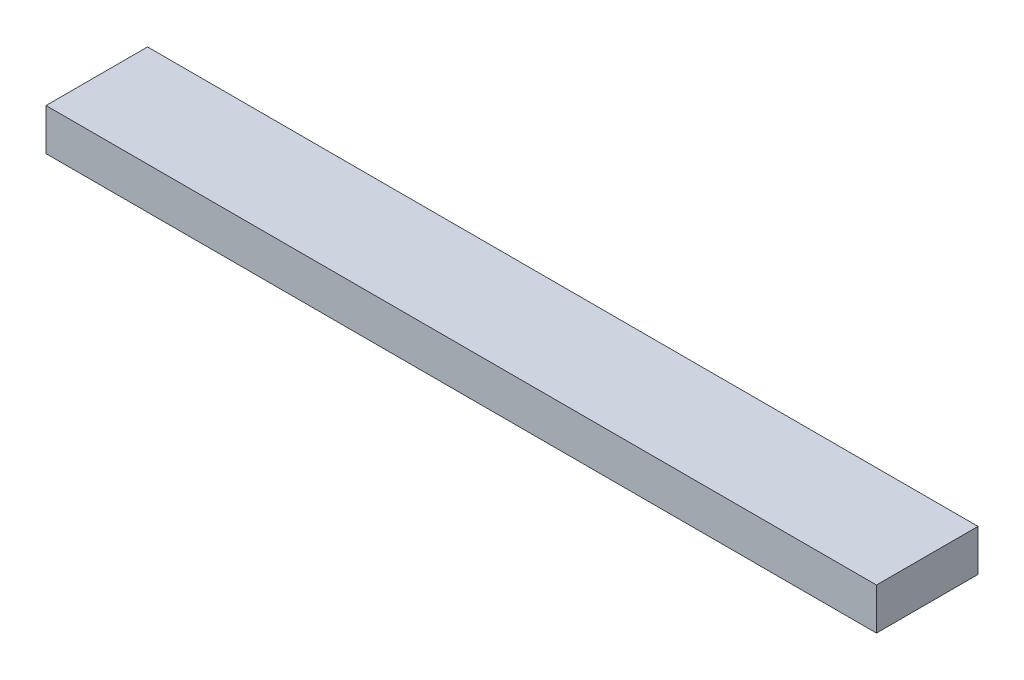
ISO-10303-21;
HEADER;
FILE_DESCRIPTION(('STEP AP214'),'2;1');
FILE_NAME('part.step','',(''),(''),'','','');
FILE_SCHEMA(('AUTOMOTIVE_DESIGN { 1 0 10303 214 1 1 1 1 }'));
ENDSEC;
DATA;
#1=APPLICATION_CONTEXT('core data for automotive mechanical design processes');
#2=APPLICATION_PROTOCOL_DEFINITION('international standard','automotive_design',2000,#1);
#3=PRODUCT_CONTEXT('',#1,'mechanical');
#4=PRODUCT('Part','Part','',(#3));
#5=PRODUCT_RELATED_PRODUCT_CATEGORY('part','',(#4));
#6=PRODUCT_DEFINITION_FORMATION('','',#4);
#7=PRODUCT_DEFINITION_CONTEXT('part definition',#1,'design');
#8=PRODUCT_DEFINITION('design','',#6,#7);
#9=PRODUCT_DEFINITION_SHAPE('','',#8);
#10=(LENGTH_UNIT() NAMED_UNIT(*) SI_UNIT(.MILLI.,.METRE.));
#11=(NAMED_UNIT(*) PLANE_ANGLE_UNIT() SI_UNIT($,.RADIAN.));
#12=(NAMED_UNIT(*) SI_UNIT($,.STERADIAN.) SOLID_ANGLE_UNIT());
#13=UNCERTAINTY_MEASURE_WITH_UNIT(LENGTH_MEASURE(1.E-05),#10,'distance_accuracy_value','');
#14=(GEOMETRIC_REPRESENTATION_CONTEXT(3) GLOBAL_UNCERTAINTY_ASSIGNED_CONTEXT((#13)) GLOBAL_UNIT_ASSIGNED_CONTEXT((#10,
#11,#12)) REPRESENTATION_CONTEXT('',''));
#15=CARTESIAN_POINT('',(0.,0.,0.));
#16=DIRECTION('',(0.,0.,1.));
#17=DIRECTION('',(1.,0.,0.));
#18=AXIS2_PLACEMENT_3D('',#15,#16,#17);
#19=CARTESIAN_POINT('',(0.,0.,0.));
#20=DIRECTION('',(0.,1.,0.));
#21=DIRECTION('',(0.,0.,1.));
#22=AXIS2_PLACEMENT_3D('',#19,#20,#21);
#23=PLANE('',#22);
#24=CARTESIAN_POINT('',(-28.,0.,0.));
#25=DIRECTION('',(0.,1.,0.));
#26=DIRECTION('',(0.,0.,1.));
#27=AXIS2_PLACEMENT_3D('',#24,#25,#26);
#28=CIRCLE('',#27,2.5);
#29=CARTESIAN_POINT('',(-28.,0.,2.5));
#30=VERTEX_POINT('',#29);
#31=EDGE_CURVE('E333',#30,#30,#28,.T.);
#32=ORIENTED_EDGE('',*,*,#31,.T.);
#33=EDGE_LOOP('',(#32));
#34=FACE_BOUND('',#33,.T.);
#35=CARTESIAN_POINT('',(28.,0.,0.));
#36=DIRECTION('',(0.,1.,0.));
#37=DIRECTION('',(0.,0.,1.));
#38=AXIS2_PLACEMENT_3D('',#35,#36,#37);
#39=CIRCLE('',#38,2.5);
#40=CARTESIAN_POINT('',(28.,0.,2.5));
#41=VERTEX_POINT('',#40);
#42=EDGE_CURVE('E344',#41,#41,#39,.T.);
#43=ORIENTED_EDGE('',*,*,#42,.T.);
#44=EDGE_LOOP('',(#43));
#45=FACE_BOUND('',#44,.T.);
#46=CARTESIAN_POINT('',(12.,0.,0.));
#47=DIRECTION('',(0.,1.,0.));
#48=DIRECTION('',(0.,0.,1.));
#49=AXIS2_PLACEMENT_3D('',#46,#47,#48);
#50=CIRCLE('',#49,2.5);
#51=CARTESIAN_POINT('',(12.,0.,2.5));
#52=VERTEX_POINT('',#51);
#53=EDGE_CURVE('E356',#52,#52,#50,.T.);
#54=ORIENTED_EDGE('',*,*,#53,.T.);
#55=EDGE_LOOP('',(#54));
#56=FACE_BOUND('',#55,.T.);
#57=CARTESIAN_POINT('',(-12.,0.,0.));
#58=DIRECTION('',(0.,1.,0.));
#59=DIRECTION('',(0.,0.,1.));
#60=AXIS2_PLACEMENT_3D('',#57,#58,#59);
#61=CIRCLE('',#60,2.5);
#62=CARTESIAN_POINT('',(-12.,0.,2.5));
#63=VERTEX_POINT('',#62);
#64=EDGE_CURVE('E365',#63,#63,#61,.T.);
#65=ORIENTED_EDGE('',*,*,#64,.T.);
#66=EDGE_LOOP('',(#65));
#67=FACE_BOUND('',#66,.T.);
#68=DIRECTION('',(0.,0.,-1.));
#69=VECTOR('',#68,1.);
#70=CARTESIAN_POINT('',(-31.9,0.,0.));
#71=LINE('',#70,#69);
#72=CARTESIAN_POINT('',(-31.9,0.,3.9));
#73=VERTEX_POINT('',#72);
#74=CARTESIAN_POINT('',(-31.9,0.,-3.9));
#75=VERTEX_POINT('',#74);
#76=EDGE_CURVE('E102',#73,#75,#71,.T.);
#77=ORIENTED_EDGE('',*,*,#76,.T.);
#78=DIRECTION('',(-1.,0.,0.));
#79=VECTOR('',#78,1.);
#80=CARTESIAN_POINT('',(0.,0.,-3.9));
#81=LINE('',#80,#79);
#82=CARTESIAN_POINT('',(31.9,0.,-3.9));
#83=VERTEX_POINT('',#82);
#84=EDGE_CURVE('E97',#83,#75,#81,.T.);
#85=ORIENTED_EDGE('',*,*,#84,.F.);
#86=DIRECTION('',(0.,0.,-1.));
#87=VECTOR('',#86,1.);
#88=CARTESIAN_POINT('',(31.9,0.,0.));
#89=LINE('',#88,#87);
#90=CARTESIAN_POINT('',(31.9,0.,3.9));
#91=VERTEX_POINT('',#90);
#92=EDGE_CURVE('E69',#91,#83,#89,.T.);
#93=ORIENTED_EDGE('',*,*,#92,.F.);
#94=DIRECTION('',(-1.,0.,0.));
#95=VECTOR('',#94,1.);
#96=CARTESIAN_POINT('',(0.,0.,3.9));
#97=LINE('',#96,#95);
#98=EDGE_CURVE('E89',#91,#73,#97,.T.);
#99=ORIENTED_EDGE('',*,*,#98,.T.);
#100=EDGE_LOOP('',(#77,#85,#93,#99));
#101=FACE_BOUND('',#100,.T.);
#102=CARTESIAN_POINT('',(-3.99999999999999,0.,0.));
#103=DIRECTION('',(0.,1.,0.));
#104=DIRECTION('',(0.,0.,1.));
#105=AXIS2_PLACEMENT_3D('',#102,#103,#104);
#106=CIRCLE('',#105,2.5);
#107=CARTESIAN_POINT('',(-3.99999999999999,0.,2.5));
#108=VERTEX_POINT('',#107);
#109=EDGE_CURVE('E362',#108,#108,#106,.T.);
#110=ORIENTED_EDGE('',*,*,#109,.T.);
#111=EDGE_LOOP('',(#110));
#112=FACE_BOUND('',#111,.T.);
#113=CARTESIAN_POINT('',(20.,0.,0.));
#114=DIRECTION('',(0.,1.,0.));
#115=DIRECTION('',(0.,0.,1.));
#116=AXIS2_PLACEMENT_3D('',#113,#114,#115);
#117=CIRCLE('',#116,2.5);
#118=CARTESIAN_POINT('',(20.,0.,2.5));
#119=VERTEX_POINT('',#118);
#120=EDGE_CURVE('E350',#119,#119,#117,.T.);
#121=ORIENTED_EDGE('',*,*,#120,.T.);
#122=EDGE_LOOP('',(#121));
#123=FACE_BOUND('',#122,.T.);
#124=CARTESIAN_POINT('',(-20.,0.,0.));
#125=DIRECTION('',(0.,1.,0.));
#126=DIRECTION('',(0.,0.,1.));
#127=AXIS2_PLACEMENT_3D('',#124,#125,#126);
#128=CIRCLE('',#127,2.5);
#129=CARTESIAN_POINT('',(-20.,0.,2.5));
#130=VERTEX_POINT('',#129);
#131=EDGE_CURVE('E338',#130,#130,#128,.T.);
#132=ORIENTED_EDGE('',*,*,#131,.T.);
#133=EDGE_LOOP('',(#132));
#134=FACE_BOUND('',#133,.T.);
#135=CARTESIAN_POINT('',(4.00000000000001,0.,0.));
#136=DIRECTION('',(0.,1.,0.));
#137=DIRECTION('',(0.,0.,1.));
#138=AXIS2_PLACEMENT_3D('',#135,#136,#137);
#139=CIRCLE('',#138,2.5);
#140=CARTESIAN_POINT('',(4.00000000000001,0.,2.5));
#141=VERTEX_POINT('',#140);
#142=EDGE_CURVE('E327',#141,#141,#139,.T.);
#143=ORIENTED_EDGE('',*,*,#142,.T.);
#144=EDGE_LOOP('',(#143));
#145=FACE_BOUND('',#144,.T.);
#146=ADVANCED_FACE('F37',(#34,#45,#56,#67,#101,#112,#123,#134,#145),#23,.F.);
#147=CARTESIAN_POINT('',(-31.9,3.2,0.));
#148=DIRECTION('',(-1.,0.,0.));
#149=DIRECTION('',(0.,0.,1.));
#150=AXIS2_PLACEMENT_3D('',#147,#148,#149);
#151=PLANE('',#150);
#152=ORIENTED_EDGE('',*,*,#76,.F.);
#153=DIRECTION('',(0.,-1.,0.));
#154=VECTOR('',#153,1.);
#155=CARTESIAN_POINT('',(-31.9,3.2,3.9));
#156=LINE('',#155,#154);
#157=CARTESIAN_POINT('',(-31.9,3.2,3.9));
#158=VERTEX_POINT('',#157);
#159=EDGE_CURVE('E11',#158,#73,#156,.T.);
#160=ORIENTED_EDGE('',*,*,#159,.F.);
#161=DIRECTION('',(0.,0.,-1.));
#162=VECTOR('',#161,1.);
#163=CARTESIAN_POINT('',(-31.9,3.2,0.));
#164=LINE('',#163,#162);
#165=CARTESIAN_POINT('',(-31.9,3.2,-3.9));
#166=VERTEX_POINT('',#165);
#167=EDGE_CURVE('E95',#158,#166,#164,.T.);
#168=ORIENTED_EDGE('',*,*,#167,.T.);
#169=DIRECTION('',(0.,-1.,0.));
#170=VECTOR('',#169,1.);
#171=CARTESIAN_POINT('',(-31.9,3.2,-3.9));
#172=LINE('',#171,#170);
#173=EDGE_CURVE('E76',#166,#75,#172,.T.);
#174=ORIENTED_EDGE('',*,*,#173,.T.);
#175=EDGE_LOOP('',(#152,#160,#168,#174));
#176=FACE_BOUND('',#175,.T.);
#177=ADVANCED_FACE('F39',(#176),#151,.T.);
#178=CARTESIAN_POINT('',(0.,3.2,3.9));
#179=DIRECTION('',(0.,0.,1.));
#180=DIRECTION('',(1.,0.,0.));
#181=AXIS2_PLACEMENT_3D('',#178,#179,#180);
#182=PLANE('',#181);
#183=ORIENTED_EDGE('',*,*,#98,.F.);
#184=DIRECTION('',(0.,-1.,0.));
#185=VECTOR('',#184,1.);
#186=CARTESIAN_POINT('',(31.9,3.2,3.9));
#187=LINE('',#186,#185);
#188=CARTESIAN_POINT('',(31.9,3.2,3.9));
#189=VERTEX_POINT('',#188);
#190=EDGE_CURVE('E46',#189,#91,#187,.T.);
#191=ORIENTED_EDGE('',*,*,#190,.F.);
#192=DIRECTION('',(-1.,0.,0.));
#193=VECTOR('',#192,1.);
#194=CARTESIAN_POINT('',(0.,3.2,3.9));
#195=LINE('',#194,#193);
#196=EDGE_CURVE('E87',#189,#158,#195,.T.);
#197=ORIENTED_EDGE('',*,*,#196,.T.);
#198=ORIENTED_EDGE('',*,*,#159,.T.);
#199=EDGE_LOOP('',(#183,#191,#197,#198));
#200=FACE_BOUND('',#199,.T.);
#201=ADVANCED_FACE('F85',(#200),#182,.T.);
#202=CARTESIAN_POINT('',(31.9,3.2,0.));
#203=DIRECTION('',(-1.,0.,0.));
#204=DIRECTION('',(0.,0.,1.));
#205=AXIS2_PLACEMENT_3D('',#202,#203,#204);
#206=PLANE('',#205);
#207=ORIENTED_EDGE('',*,*,#92,.T.);
#208=DIRECTION('',(0.,-1.,0.));
#209=VECTOR('',#208,1.);
#210=CARTESIAN_POINT('',(31.9,3.2,-3.9));
#211=LINE('',#210,#209);
#212=CARTESIAN_POINT('',(31.9,3.2,-3.9));
#213=VERTEX_POINT('',#212);
#214=EDGE_CURVE('E90',#213,#83,#211,.T.);
#215=ORIENTED_EDGE('',*,*,#214,.F.);
#216=DIRECTION('',(0.,0.,-1.));
#217=VECTOR('',#216,1.);
#218=CARTESIAN_POINT('',(31.9,3.2,0.));
#219=LINE('',#218,#217);
#220=EDGE_CURVE('E91',#189,#213,#219,.T.);
#221=ORIENTED_EDGE('',*,*,#220,.F.);
#222=ORIENTED_EDGE('',*,*,#190,.T.);
#223=EDGE_LOOP('',(#207,#215,#221,#222));
#224=FACE_BOUND('',#223,.T.);
#225=ADVANCED_FACE('F92',(#224),#206,.F.);
#226=CARTESIAN_POINT('',(0.,3.2,-3.9));
#227=DIRECTION('',(0.,0.,1.));
#228=DIRECTION('',(1.,0.,0.));
#229=AXIS2_PLACEMENT_3D('',#226,#227,#228);
#230=PLANE('',#229);
#231=ORIENTED_EDGE('',*,*,#84,.T.);
#232=ORIENTED_EDGE('',*,*,#173,.F.);
#233=DIRECTION('',(-1.,0.,0.));
#234=VECTOR('',#233,1.);
#235=CARTESIAN_POINT('',(0.,3.2,-3.9));
#236=LINE('',#235,#234);
#237=EDGE_CURVE('E54',#213,#166,#236,.T.);
#238=ORIENTED_EDGE('',*,*,#237,.F.);
#239=ORIENTED_EDGE('',*,*,#214,.T.);
#240=EDGE_LOOP('',(#231,#232,#238,#239));
#241=FACE_BOUND('',#240,.T.);
#242=ADVANCED_FACE('F112',(#241),#230,.F.);
#243=CARTESIAN_POINT('',(0.,3.2,0.));
#244=DIRECTION('',(0.,1.,0.));
#245=DIRECTION('',(0.,0.,1.));
#246=AXIS2_PLACEMENT_3D('',#243,#244,#245);
#247=PLANE('',#246);
#248=ORIENTED_EDGE('',*,*,#167,.F.);
#249=ORIENTED_EDGE('',*,*,#196,.F.);
#250=ORIENTED_EDGE('',*,*,#220,.T.);
#251=ORIENTED_EDGE('',*,*,#237,.T.);
#252=EDGE_LOOP('',(#248,#249,#250,#251));
#253=FACE_BOUND('',#252,.T.);
#254=ADVANCED_FACE('F94',(#253),#247,.T.);
#255=CARTESIAN_POINT('',(-12.,1.8,0.));
#256=DIRECTION('',(0.,-1.,0.));
#257=DIRECTION('',(0.,0.,-1.));
#258=AXIS2_PLACEMENT_3D('',#255,#256,#257);
#259=CYLINDRICAL_SURFACE('',#258,2.5);
#260=CARTESIAN_POINT('',(-12.,1.8,0.));
#261=DIRECTION('',(0.,1.,0.));
#262=DIRECTION('',(0.,0.,1.));
#263=AXIS2_PLACEMENT_3D('',#260,#261,#262);
#264=CIRCLE('',#263,2.5);
#265=CARTESIAN_POINT('',(-12.,1.8,2.5));
#266=VERTEX_POINT('',#265);
#267=EDGE_CURVE('E105',#266,#266,#264,.T.);
#268=ORIENTED_EDGE('',*,*,#267,.T.);
#269=EDGE_LOOP('',(#268));
#270=FACE_BOUND('',#269,.T.);
#271=ORIENTED_EDGE('',*,*,#64,.F.);
#272=EDGE_LOOP('',(#271));
#273=FACE_BOUND('',#272,.T.);
#274=ADVANCED_FACE('F146',(#270,#273),#259,.F.);
#275=CARTESIAN_POINT('',(0.,1.8,0.));
#276=DIRECTION('',(0.,1.,0.));
#277=DIRECTION('',(0.,0.,1.));
#278=AXIS2_PLACEMENT_3D('',#275,#276,#277);
#279=PLANE('',#278);
#280=ORIENTED_EDGE('',*,*,#267,.F.);
#281=EDGE_LOOP('',(#280));
#282=FACE_BOUND('',#281,.T.);
#283=ADVANCED_FACE('F152',(#282),#279,.F.);
#284=CARTESIAN_POINT('',(-3.99999999999999,1.8,0.));
#285=DIRECTION('',(0.,-1.,0.));
#286=DIRECTION('',(0.,0.,-1.));
#287=AXIS2_PLACEMENT_3D('',#284,#285,#286);
#288=CYLINDRICAL_SURFACE('',#287,2.5);
#289=CARTESIAN_POINT('',(-3.99999999999999,1.8,0.));
#290=DIRECTION('',(0.,1.,0.));
#291=DIRECTION('',(0.,0.,1.));
#292=AXIS2_PLACEMENT_3D('',#289,#290,#291);
#293=CIRCLE('',#292,2.5);
#294=CARTESIAN_POINT('',(-3.99999999999999,1.8,2.5));
#295=VERTEX_POINT('',#294);
#296=EDGE_CURVE('E359',#295,#295,#293,.T.);
#297=ORIENTED_EDGE('',*,*,#296,.T.);
#298=EDGE_LOOP('',(#297));
#299=FACE_BOUND('',#298,.T.);
#300=ORIENTED_EDGE('',*,*,#109,.F.);
#301=EDGE_LOOP('',(#300));
#302=FACE_BOUND('',#301,.T.);
#303=ADVANCED_FACE('F159',(#299,#302),#288,.F.);
#304=CARTESIAN_POINT('',(0.,1.8,0.));
#305=DIRECTION('',(0.,1.,0.));
#306=DIRECTION('',(0.,0.,1.));
#307=AXIS2_PLACEMENT_3D('',#304,#305,#306);
#308=PLANE('',#307);
#309=ORIENTED_EDGE('',*,*,#296,.F.);
#310=EDGE_LOOP('',(#309));
#311=FACE_BOUND('',#310,.T.);
#312=ADVANCED_FACE('F167',(#311),#308,.F.);
#313=CARTESIAN_POINT('',(12.,1.8,0.));
#314=DIRECTION('',(0.,-1.,0.));
#315=DIRECTION('',(0.,0.,-1.));
#316=AXIS2_PLACEMENT_3D('',#313,#314,#315);
#317=CYLINDRICAL_SURFACE('',#316,2.5);
#318=CARTESIAN_POINT('',(12.,1.8,0.));
#319=DIRECTION('',(0.,1.,0.));
#320=DIRECTION('',(0.,0.,1.));
#321=AXIS2_PLACEMENT_3D('',#318,#319,#320);
#322=CIRCLE('',#321,2.5);
#323=CARTESIAN_POINT('',(12.,1.8,2.5));
#324=VERTEX_POINT('',#323);
#325=EDGE_CURVE('E353',#324,#324,#322,.T.);
#326=ORIENTED_EDGE('',*,*,#325,.T.);
#327=EDGE_LOOP('',(#326));
#328=FACE_BOUND('',#327,.T.);
#329=ORIENTED_EDGE('',*,*,#53,.F.);
#330=EDGE_LOOP('',(#329));
#331=FACE_BOUND('',#330,.T.);
#332=ADVANCED_FACE('F175',(#328,#331),#317,.F.);
#333=CARTESIAN_POINT('',(0.,1.8,0.));
#334=DIRECTION('',(0.,1.,0.));
#335=DIRECTION('',(0.,0.,1.));
#336=AXIS2_PLACEMENT_3D('',#333,#334,#335);
#337=PLANE('',#336);
#338=ORIENTED_EDGE('',*,*,#325,.F.);
#339=EDGE_LOOP('',(#338));
#340=FACE_BOUND('',#339,.T.);
#341=ADVANCED_FACE('F183',(#340),#337,.F.);
#342=CARTESIAN_POINT('',(20.,1.8,0.));
#343=DIRECTION('',(0.,-1.,0.));
#344=DIRECTION('',(0.,0.,-1.));
#345=AXIS2_PLACEMENT_3D('',#342,#343,#344);
#346=CYLINDRICAL_SURFACE('',#345,2.5);
#347=CARTESIAN_POINT('',(20.,1.8,0.));
#348=DIRECTION('',(0.,1.,0.));
#349=DIRECTION('',(0.,0.,1.));
#350=AXIS2_PLACEMENT_3D('',#347,#348,#349);
#351=CIRCLE('',#350,2.5);
#352=CARTESIAN_POINT('',(20.,1.8,2.5));
#353=VERTEX_POINT('',#352);
#354=EDGE_CURVE('E347',#353,#353,#351,.T.);
#355=ORIENTED_EDGE('',*,*,#354,.T.);
#356=EDGE_LOOP('',(#355));
#357=FACE_BOUND('',#356,.T.);
#358=ORIENTED_EDGE('',*,*,#120,.F.);
#359=EDGE_LOOP('',(#358));
#360=FACE_BOUND('',#359,.T.);
#361=ADVANCED_FACE('F191',(#357,#360),#346,.F.);
#362=CARTESIAN_POINT('',(0.,1.8,0.));
#363=DIRECTION('',(0.,1.,0.));
#364=DIRECTION('',(0.,0.,1.));
#365=AXIS2_PLACEMENT_3D('',#362,#363,#364);
#366=PLANE('',#365);
#367=ORIENTED_EDGE('',*,*,#354,.F.);
#368=EDGE_LOOP('',(#367));
#369=FACE_BOUND('',#368,.T.);
#370=ADVANCED_FACE('F199',(#369),#366,.F.);
#371=CARTESIAN_POINT('',(28.,1.8,0.));
#372=DIRECTION('',(0.,-1.,0.));
#373=DIRECTION('',(0.,0.,-1.));
#374=AXIS2_PLACEMENT_3D('',#371,#372,#373);
#375=CYLINDRICAL_SURFACE('',#374,2.5);
#376=CARTESIAN_POINT('',(28.,1.8,0.));
#377=DIRECTION('',(0.,1.,0.));
#378=DIRECTION('',(0.,0.,1.));
#379=AXIS2_PLACEMENT_3D('',#376,#377,#378);
#380=CIRCLE('',#379,2.5);
#381=CARTESIAN_POINT('',(28.,1.8,2.5));
#382=VERTEX_POINT('',#381);
#383=EDGE_CURVE('E341',#382,#382,#380,.T.);
#384=ORIENTED_EDGE('',*,*,#383,.T.);
#385=EDGE_LOOP('',(#384));
#386=FACE_BOUND('',#385,.T.);
#387=ORIENTED_EDGE('',*,*,#42,.F.);
#388=EDGE_LOOP('',(#387));
#389=FACE_BOUND('',#388,.T.);
#390=ADVANCED_FACE('F207',(#386,#389),#375,.F.);
#391=CARTESIAN_POINT('',(0.,1.8,0.));
#392=DIRECTION('',(0.,1.,0.));
#393=DIRECTION('',(0.,0.,1.));
#394=AXIS2_PLACEMENT_3D('',#391,#392,#393);
#395=PLANE('',#394);
#396=ORIENTED_EDGE('',*,*,#383,.F.);
#397=EDGE_LOOP('',(#396));
#398=FACE_BOUND('',#397,.T.);
#399=ADVANCED_FACE('F215',(#398),#395,.F.);
#400=CARTESIAN_POINT('',(-20.,1.8,0.));
#401=DIRECTION('',(0.,-1.,0.));
#402=DIRECTION('',(0.,0.,-1.));
#403=AXIS2_PLACEMENT_3D('',#400,#401,#402);
#404=CYLINDRICAL_SURFACE('',#403,2.5);
#405=CARTESIAN_POINT('',(-20.,1.8,0.));
#406=DIRECTION('',(0.,1.,0.));
#407=DIRECTION('',(0.,0.,1.));
#408=AXIS2_PLACEMENT_3D('',#405,#406,#407);
#409=CIRCLE('',#408,2.5);
#410=CARTESIAN_POINT('',(-20.,1.8,2.5));
#411=VERTEX_POINT('',#410);
#412=EDGE_CURVE('E335',#411,#411,#409,.T.);
#413=ORIENTED_EDGE('',*,*,#412,.T.);
#414=EDGE_LOOP('',(#413));
#415=FACE_BOUND('',#414,.T.);
#416=ORIENTED_EDGE('',*,*,#131,.F.);
#417=EDGE_LOOP('',(#416));
#418=FACE_BOUND('',#417,.T.);
#419=ADVANCED_FACE('F223',(#415,#418),#404,.F.);
#420=CARTESIAN_POINT('',(0.,1.8,0.));
#421=DIRECTION('',(0.,1.,0.));
#422=DIRECTION('',(0.,0.,1.));
#423=AXIS2_PLACEMENT_3D('',#420,#421,#422);
#424=PLANE('',#423);
#425=ORIENTED_EDGE('',*,*,#412,.F.);
#426=EDGE_LOOP('',(#425));
#427=FACE_BOUND('',#426,.T.);
#428=ADVANCED_FACE('F231',(#427),#424,.F.);
#429=CARTESIAN_POINT('',(-28.,1.8,0.));
#430=DIRECTION('',(0.,-1.,0.));
#431=DIRECTION('',(0.,0.,-1.));
#432=AXIS2_PLACEMENT_3D('',#429,#430,#431);
#433=CYLINDRICAL_SURFACE('',#432,2.5);
#434=CARTESIAN_POINT('',(-28.,1.8,0.));
#435=DIRECTION('',(0.,1.,0.));
#436=DIRECTION('',(0.,0.,1.));
#437=AXIS2_PLACEMENT_3D('',#434,#435,#436);
#438=CIRCLE('',#437,2.5);
#439=CARTESIAN_POINT('',(-28.,1.8,2.5));
#440=VERTEX_POINT('',#439);
#441=EDGE_CURVE('E330',#440,#440,#438,.T.);
#442=ORIENTED_EDGE('',*,*,#441,.T.);
#443=EDGE_LOOP('',(#442));
#444=FACE_BOUND('',#443,.T.);
#445=ORIENTED_EDGE('',*,*,#31,.F.);
#446=EDGE_LOOP('',(#445));
#447=FACE_BOUND('',#446,.T.);
#448=ADVANCED_FACE('F239',(#444,#447),#433,.F.);
#449=CARTESIAN_POINT('',(0.,1.8,0.));
#450=DIRECTION('',(0.,1.,0.));
#451=DIRECTION('',(0.,0.,1.));
#452=AXIS2_PLACEMENT_3D('',#449,#450,#451);
#453=PLANE('',#452);
#454=ORIENTED_EDGE('',*,*,#441,.F.);
#455=EDGE_LOOP('',(#454));
#456=FACE_BOUND('',#455,.T.);
#457=ADVANCED_FACE('F247',(#456),#453,.F.);
#458=CARTESIAN_POINT('',(4.00000000000001,1.8,0.));
#459=DIRECTION('',(0.,-1.,0.));
#460=DIRECTION('',(0.,0.,-1.));
#461=AXIS2_PLACEMENT_3D('',#458,#459,#460);
#462=CYLINDRICAL_SURFACE('',#461,2.5);
#463=CARTESIAN_POINT('',(4.00000000000001,1.8,0.));
#464=DIRECTION('',(0.,1.,0.));
#465=DIRECTION('',(0.,0.,1.));
#466=AXIS2_PLACEMENT_3D('',#463,#464,#465);
#467=CIRCLE('',#466,2.5);
#468=CARTESIAN_POINT('',(4.00000000000001,1.8,2.5));
#469=VERTEX_POINT('',#468);
#470=EDGE_CURVE('E326',#469,#469,#467,.T.);
#471=ORIENTED_EDGE('',*,*,#470,.T.);
#472=EDGE_LOOP('',(#471));
#473=FACE_BOUND('',#472,.T.);
#474=ORIENTED_EDGE('',*,*,#142,.F.);
#475=EDGE_LOOP('',(#474));
#476=FACE_BOUND('',#475,.T.);
#477=ADVANCED_FACE('F255',(#473,#476),#462,.F.);
#478=CARTESIAN_POINT('',(4.00000000000001,1.8,0.));
#479=DIRECTION('',(0.,1.,0.));
#480=DIRECTION('',(0.,0.,1.));
#481=AXIS2_PLACEMENT_3D('',#478,#479,#480);
#482=PLANE('',#481);
#483=ORIENTED_EDGE('',*,*,#470,.F.);
#484=EDGE_LOOP('',(#483));
#485=FACE_BOUND('',#484,.T.);
#486=ADVANCED_FACE('F263',(#485),#482,.F.);
#487=CLOSED_SHELL('',(#146,#177,#201,#225,#242,#254,#274,#283,#303,#312,#332,#341,#361,#370,
#390,#399,#419,#428,#448,#457,#477,#486));
#488=MANIFOLD_SOLID_BREP('B2',#487);
#489=ADVANCED_BREP_SHAPE_REPRESENTATION('',(#18,#488),#14);
#490=SHAPE_DEFINITION_REPRESENTATION(#9,#489);
ENDSEC;
END-ISO-10303-21;
